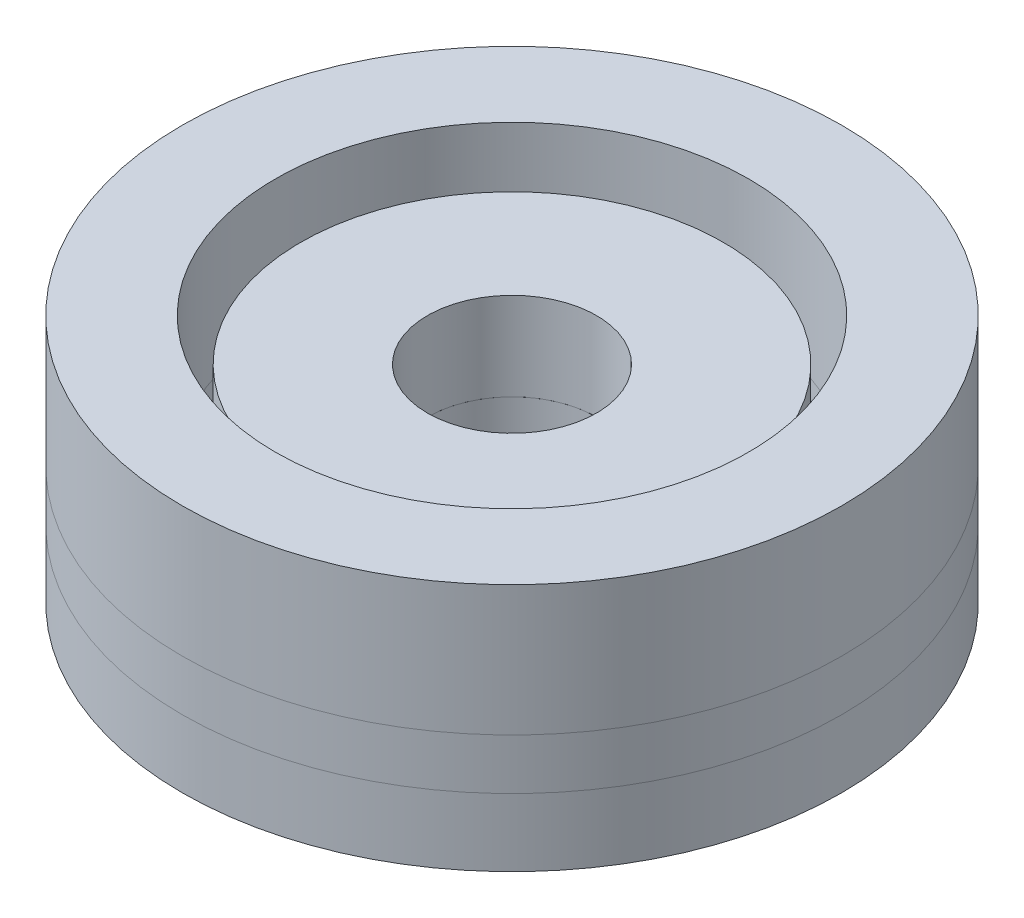
ISO-10303-21;
HEADER;
FILE_DESCRIPTION(('STEP AP214'),'2;1');
FILE_NAME('part.step','',(''),(''),'','','');
FILE_SCHEMA(('AUTOMOTIVE_DESIGN { 1 0 10303 214 1 1 1 1 }'));
ENDSEC;
DATA;
#1=APPLICATION_CONTEXT('core data for automotive mechanical design processes');
#2=APPLICATION_PROTOCOL_DEFINITION('international standard','automotive_design',2000,#1);
#3=PRODUCT_CONTEXT('',#1,'mechanical');
#4=PRODUCT('Part','Part','',(#3));
#5=PRODUCT_RELATED_PRODUCT_CATEGORY('part','',(#4));
#6=PRODUCT_DEFINITION_FORMATION('','',#4);
#7=PRODUCT_DEFINITION_CONTEXT('part definition',#1,'design');
#8=PRODUCT_DEFINITION('design','',#6,#7);
#9=PRODUCT_DEFINITION_SHAPE('','',#8);
#10=(LENGTH_UNIT() NAMED_UNIT(*) SI_UNIT(.MILLI.,.METRE.));
#11=(NAMED_UNIT(*) PLANE_ANGLE_UNIT() SI_UNIT($,.RADIAN.));
#12=(NAMED_UNIT(*) SI_UNIT($,.STERADIAN.) SOLID_ANGLE_UNIT());
#13=UNCERTAINTY_MEASURE_WITH_UNIT(LENGTH_MEASURE(1.E-05),#10,'distance_accuracy_value','');
#14=(GEOMETRIC_REPRESENTATION_CONTEXT(3) GLOBAL_UNCERTAINTY_ASSIGNED_CONTEXT((#13)) GLOBAL_UNIT_ASSIGNED_CONTEXT((#10,
#11,#12)) REPRESENTATION_CONTEXT('',''));
#15=CARTESIAN_POINT('',(0.,0.,0.));
#16=DIRECTION('',(0.,0.,1.));
#17=DIRECTION('',(1.,0.,0.));
#18=AXIS2_PLACEMENT_3D('',#15,#16,#17);
#19=CARTESIAN_POINT('',(514.982170762374,-177.,0.));
#20=DIRECTION('',(0.,-1.,0.));
#21=DIRECTION('',(0.,0.,-1.));
#22=AXIS2_PLACEMENT_3D('',#19,#20,#21);
#23=PLANE('',#22);
#24=CARTESIAN_POINT('',(514.982170762374,-177.,0.));
#25=DIRECTION('',(0.,-1.,0.));
#26=DIRECTION('',(0.,0.,-1.));
#27=AXIS2_PLACEMENT_3D('',#24,#25,#26);
#28=CIRCLE('',#27,125.);
#29=CARTESIAN_POINT('',(514.982170762374,-177.,-125.));
#30=VERTEX_POINT('',#29);
#31=EDGE_CURVE('E11',#30,#30,#28,.T.);
#32=ORIENTED_EDGE('',*,*,#31,.T.);
#33=EDGE_LOOP('',(#32));
#34=FACE_BOUND('',#33,.T.);
#35=CARTESIAN_POINT('',(514.982170762374,-177.,0.));
#36=DIRECTION('',(0.,-1.,0.));
#37=DIRECTION('',(0.,0.,-1.));
#38=AXIS2_PLACEMENT_3D('',#35,#36,#37);
#39=CIRCLE('',#38,50.0000000000001);
#40=CARTESIAN_POINT('',(514.982170762374,-177.,-50.0000000000001));
#41=VERTEX_POINT('',#40);
#42=EDGE_CURVE('E57',#41,#41,#39,.T.);
#43=ORIENTED_EDGE('',*,*,#42,.F.);
#44=EDGE_LOOP('',(#43));
#45=FACE_BOUND('',#44,.T.);
#46=ADVANCED_FACE('F46',(#34,#45),#23,.T.);
#47=CARTESIAN_POINT('',(514.982170762374,-107.,0.));
#48=DIRECTION('',(0.,-1.,0.));
#49=DIRECTION('',(0.,0.,-1.));
#50=AXIS2_PLACEMENT_3D('',#47,#48,#49);
#51=PLANE('',#50);
#52=CARTESIAN_POINT('',(514.982170762374,-107.,0.));
#53=DIRECTION('',(0.,-1.,0.));
#54=DIRECTION('',(0.,0.,-1.));
#55=AXIS2_PLACEMENT_3D('',#52,#53,#54);
#56=CIRCLE('',#55,125.);
#57=CARTESIAN_POINT('',(514.982170762374,-107.,-125.));
#58=VERTEX_POINT('',#57);
#59=EDGE_CURVE('E50',#58,#58,#56,.T.);
#60=ORIENTED_EDGE('',*,*,#59,.F.);
#61=EDGE_LOOP('',(#60));
#62=FACE_BOUND('',#61,.T.);
#63=CARTESIAN_POINT('',(514.982170762374,-107.,0.));
#64=DIRECTION('',(0.,-1.,0.));
#65=DIRECTION('',(0.,0.,-1.));
#66=AXIS2_PLACEMENT_3D('',#63,#64,#65);
#67=CIRCLE('',#66,50.0000000000001);
#68=CARTESIAN_POINT('',(514.982170762374,-107.,-50.0000000000001));
#69=VERTEX_POINT('',#68);
#70=EDGE_CURVE('E59',#69,#69,#67,.T.);
#71=ORIENTED_EDGE('',*,*,#70,.T.);
#72=EDGE_LOOP('',(#71));
#73=FACE_BOUND('',#72,.T.);
#74=ADVANCED_FACE('F69',(#62,#73),#51,.F.);
#75=CARTESIAN_POINT('',(514.982170762374,-177.,0.));
#76=DIRECTION('',(0.,1.,0.));
#77=DIRECTION('',(0.,0.,1.));
#78=AXIS2_PLACEMENT_3D('',#75,#76,#77);
#79=CYLINDRICAL_SURFACE('',#78,125.);
#80=ORIENTED_EDGE('',*,*,#31,.F.);
#81=EDGE_LOOP('',(#80));
#82=FACE_BOUND('',#81,.T.);
#83=ORIENTED_EDGE('',*,*,#59,.T.);
#84=EDGE_LOOP('',(#83));
#85=FACE_BOUND('',#84,.T.);
#86=ADVANCED_FACE('F48',(#82,#85),#79,.T.);
#87=CARTESIAN_POINT('',(514.982170762374,-177.,0.));
#88=DIRECTION('',(0.,1.,0.));
#89=DIRECTION('',(0.,0.,1.));
#90=AXIS2_PLACEMENT_3D('',#87,#88,#89);
#91=CYLINDRICAL_SURFACE('',#90,50.0000000000001);
#92=ORIENTED_EDGE('',*,*,#42,.T.);
#93=EDGE_LOOP('',(#92));
#94=FACE_BOUND('',#93,.T.);
#95=ORIENTED_EDGE('',*,*,#70,.F.);
#96=EDGE_LOOP('',(#95));
#97=FACE_BOUND('',#96,.T.);
#98=ADVANCED_FACE('F65',(#94,#97),#91,.F.);
#99=CLOSED_SHELL('',(#46,#74,#86,#98));
#100=MANIFOLD_SOLID_BREP('B2',#99);
#101=CARTESIAN_POINT('',(514.982170762374,-107.,0.));
#102=DIRECTION('',(0.,-1.,0.));
#103=DIRECTION('',(0.,0.,-1.));
#104=AXIS2_PLACEMENT_3D('',#101,#102,#103);
#105=PLANE('',#104);
#106=CARTESIAN_POINT('',(514.982170762374,-107.,0.));
#107=DIRECTION('',(0.,-1.,0.));
#108=DIRECTION('',(0.,0.,-1.));
#109=AXIS2_PLACEMENT_3D('',#106,#107,#108);
#110=CIRCLE('',#109,125.);
#111=CARTESIAN_POINT('',(514.982170762374,-107.,-125.));
#112=VERTEX_POINT('',#111);
#113=EDGE_CURVE('E45',#112,#112,#110,.T.);
#114=ORIENTED_EDGE('',*,*,#113,.T.);
#115=EDGE_LOOP('',(#114));
#116=FACE_BOUND('',#115,.T.);
#117=CARTESIAN_POINT('',(514.982170762374,-107.,0.));
#118=DIRECTION('',(0.,-1.,0.));
#119=DIRECTION('',(0.,0.,-1.));
#120=AXIS2_PLACEMENT_3D('',#117,#118,#119);
#121=CIRCLE('',#120,50.0000000000001);
#122=CARTESIAN_POINT('',(514.982170762374,-107.,-50.0000000000001));
#123=VERTEX_POINT('',#122);
#124=EDGE_CURVE('E127',#123,#123,#121,.T.);
#125=ORIENTED_EDGE('',*,*,#124,.F.);
#126=EDGE_LOOP('',(#125));
#127=FACE_BOUND('',#126,.T.);
#128=ADVANCED_FACE('F116',(#116,#127),#105,.T.);
#129=CARTESIAN_POINT('',(514.982170762374,-77.,0.));
#130=DIRECTION('',(0.,-1.,0.));
#131=DIRECTION('',(0.,0.,-1.));
#132=AXIS2_PLACEMENT_3D('',#129,#130,#131);
#133=PLANE('',#132);
#134=CARTESIAN_POINT('',(514.982170762374,-77.,0.));
#135=DIRECTION('',(0.,-1.,0.));
#136=DIRECTION('',(0.,0.,-1.));
#137=AXIS2_PLACEMENT_3D('',#134,#135,#136);
#138=CIRCLE('',#137,125.);
#139=CARTESIAN_POINT('',(514.982170762374,-77.,-125.));
#140=VERTEX_POINT('',#139);
#141=EDGE_CURVE('E120',#140,#140,#138,.T.);
#142=ORIENTED_EDGE('',*,*,#141,.F.);
#143=EDGE_LOOP('',(#142));
#144=FACE_BOUND('',#143,.T.);
#145=CARTESIAN_POINT('',(514.982170762374,-77.,0.));
#146=DIRECTION('',(0.,-1.,0.));
#147=DIRECTION('',(0.,0.,-1.));
#148=AXIS2_PLACEMENT_3D('',#145,#146,#147);
#149=CIRCLE('',#148,50.0000000000001);
#150=CARTESIAN_POINT('',(514.982170762374,-77.,-50.0000000000001));
#151=VERTEX_POINT('',#150);
#152=EDGE_CURVE('E129',#151,#151,#149,.T.);
#153=ORIENTED_EDGE('',*,*,#152,.T.);
#154=EDGE_LOOP('',(#153));
#155=FACE_BOUND('',#154,.T.);
#156=ADVANCED_FACE('F139',(#144,#155),#133,.F.);
#157=CARTESIAN_POINT('',(514.982170762374,-107.,0.));
#158=DIRECTION('',(0.,1.,0.));
#159=DIRECTION('',(0.,0.,1.));
#160=AXIS2_PLACEMENT_3D('',#157,#158,#159);
#161=CYLINDRICAL_SURFACE('',#160,125.);
#162=ORIENTED_EDGE('',*,*,#113,.F.);
#163=EDGE_LOOP('',(#162));
#164=FACE_BOUND('',#163,.T.);
#165=ORIENTED_EDGE('',*,*,#141,.T.);
#166=EDGE_LOOP('',(#165));
#167=FACE_BOUND('',#166,.T.);
#168=ADVANCED_FACE('F118',(#164,#167),#161,.T.);
#169=CARTESIAN_POINT('',(514.982170762374,-107.,0.));
#170=DIRECTION('',(0.,1.,0.));
#171=DIRECTION('',(0.,0.,1.));
#172=AXIS2_PLACEMENT_3D('',#169,#170,#171);
#173=CYLINDRICAL_SURFACE('',#172,50.0000000000001);
#174=ORIENTED_EDGE('',*,*,#124,.T.);
#175=EDGE_LOOP('',(#174));
#176=FACE_BOUND('',#175,.T.);
#177=ORIENTED_EDGE('',*,*,#152,.F.);
#178=EDGE_LOOP('',(#177));
#179=FACE_BOUND('',#178,.T.);
#180=ADVANCED_FACE('F135',(#176,#179),#173,.F.);
#181=CLOSED_SHELL('',(#128,#156,#168,#180));
#182=MANIFOLD_SOLID_BREP('B6',#181);
#183=CARTESIAN_POINT('',(514.982170762374,-77.,0.));
#184=DIRECTION('',(0.,1.,0.));
#185=DIRECTION('',(0.,0.,1.));
#186=AXIS2_PLACEMENT_3D('',#183,#184,#185);
#187=CYLINDRICAL_SURFACE('',#186,125.);
#188=CARTESIAN_POINT('',(514.982170762374,-77.,0.));
#189=DIRECTION('',(0.,1.,0.));
#190=DIRECTION('',(0.,0.,1.));
#191=AXIS2_PLACEMENT_3D('',#188,#189,#190);
#192=CIRCLE('',#191,125.);
#193=CARTESIAN_POINT('',(514.982170762374,-77.,125.));
#194=VERTEX_POINT('',#193);
#195=EDGE_CURVE('E115',#194,#194,#192,.T.);
#196=CARTESIAN_POINT('',(514.982170762374,-25.,0.));
#197=DIRECTION('',(0.,1.,0.));
#198=DIRECTION('',(0.,0.,1.));
#199=AXIS2_PLACEMENT_3D('',#196,#197,#198);
#200=CIRCLE('',#199,125.);
#201=CARTESIAN_POINT('',(514.982170762374,-25.,125.));
#202=VERTEX_POINT('',#201);
#203=EDGE_CURVE('E189',#202,#202,#200,.T.);
#204=CARTESIAN_POINT('',(514.982170762374,-77.,125.));
#205=CARTESIAN_POINT('',(514.982170762374,-76.4583333333333,125.));
#206=CARTESIAN_POINT('',(514.982170762374,-75.9166666666667,125.));
#207=CARTESIAN_POINT('',(514.982170762374,-74.8333333333333,125.));
#208=CARTESIAN_POINT('',(514.982170762374,-74.2916666666667,125.));
#209=CARTESIAN_POINT('',(514.982170762374,-73.2083333333333,125.));
#210=CARTESIAN_POINT('',(514.982170762374,-72.6666666666667,125.));
#211=CARTESIAN_POINT('',(514.982170762374,-71.5833333333333,125.));
#212=CARTESIAN_POINT('',(514.982170762374,-71.0416666666667,125.));
#213=CARTESIAN_POINT('',(514.982170762374,-69.9583333333333,125.));
#214=CARTESIAN_POINT('',(514.982170762374,-69.4166666666667,125.));
#215=CARTESIAN_POINT('',(514.982170762374,-68.3333333333333,125.));
#216=CARTESIAN_POINT('',(514.982170762374,-67.7916666666667,125.));
#217=CARTESIAN_POINT('',(514.982170762374,-66.7083333333333,125.));
#218=CARTESIAN_POINT('',(514.982170762374,-66.1666666666667,125.));
#219=CARTESIAN_POINT('',(514.982170762374,-65.0833333333333,125.));
#220=CARTESIAN_POINT('',(514.982170762374,-64.5416666666667,125.));
#221=CARTESIAN_POINT('',(514.982170762374,-63.4583333333333,125.));
#222=CARTESIAN_POINT('',(514.982170762374,-62.9166666666667,125.));
#223=CARTESIAN_POINT('',(514.982170762374,-61.8333333333333,125.));
#224=CARTESIAN_POINT('',(514.982170762374,-61.2916666666667,125.));
#225=CARTESIAN_POINT('',(514.982170762374,-60.2083333333333,125.));
#226=CARTESIAN_POINT('',(514.982170762374,-59.6666666666667,125.));
#227=CARTESIAN_POINT('',(514.982170762374,-58.5833333333333,125.));
#228=CARTESIAN_POINT('',(514.982170762374,-58.0416666666667,125.));
#229=CARTESIAN_POINT('',(514.982170762374,-56.9583333333333,125.));
#230=CARTESIAN_POINT('',(514.982170762374,-56.4166666666667,125.));
#231=CARTESIAN_POINT('',(514.982170762374,-55.3333333333333,125.));
#232=CARTESIAN_POINT('',(514.982170762374,-54.7916666666667,125.));
#233=CARTESIAN_POINT('',(514.982170762374,-53.7083333333333,125.));
#234=CARTESIAN_POINT('',(514.982170762374,-53.1666666666667,125.));
#235=CARTESIAN_POINT('',(514.982170762374,-52.0833333333333,125.));
#236=CARTESIAN_POINT('',(514.982170762374,-51.5416666666667,125.));
#237=CARTESIAN_POINT('',(514.982170762374,-50.4583333333333,125.));
#238=CARTESIAN_POINT('',(514.982170762374,-49.9166666666667,125.));
#239=CARTESIAN_POINT('',(514.982170762374,-48.8333333333333,125.));
#240=CARTESIAN_POINT('',(514.982170762374,-48.2916666666667,125.));
#241=CARTESIAN_POINT('',(514.982170762374,-47.2083333333333,125.));
#242=CARTESIAN_POINT('',(514.982170762374,-46.6666666666667,125.));
#243=CARTESIAN_POINT('',(514.982170762374,-45.5833333333333,125.));
#244=CARTESIAN_POINT('',(514.982170762374,-45.0416666666667,125.));
#245=CARTESIAN_POINT('',(514.982170762374,-43.9583333333333,125.));
#246=CARTESIAN_POINT('',(514.982170762374,-43.4166666666667,125.));
#247=CARTESIAN_POINT('',(514.982170762374,-42.3333333333333,125.));
#248=CARTESIAN_POINT('',(514.982170762374,-41.7916666666667,125.));
#249=CARTESIAN_POINT('',(514.982170762374,-40.7083333333333,125.));
#250=CARTESIAN_POINT('',(514.982170762374,-40.1666666666667,125.));
#251=CARTESIAN_POINT('',(514.982170762374,-39.0833333333333,125.));
#252=CARTESIAN_POINT('',(514.982170762374,-38.5416666666667,125.));
#253=CARTESIAN_POINT('',(514.982170762374,-37.4583333333333,125.));
#254=CARTESIAN_POINT('',(514.982170762374,-36.9166666666667,125.));
#255=CARTESIAN_POINT('',(514.982170762374,-35.8333333333333,125.));
#256=CARTESIAN_POINT('',(514.982170762374,-35.2916666666667,125.));
#257=CARTESIAN_POINT('',(514.982170762374,-34.2083333333333,125.));
#258=CARTESIAN_POINT('',(514.982170762374,-33.6666666666667,125.));
#259=CARTESIAN_POINT('',(514.982170762374,-32.5833333333333,125.));
#260=CARTESIAN_POINT('',(514.982170762374,-32.0416666666667,125.));
#261=CARTESIAN_POINT('',(514.982170762374,-30.9583333333333,125.));
#262=CARTESIAN_POINT('',(514.982170762374,-30.4166666666667,125.));
#263=CARTESIAN_POINT('',(514.982170762374,-29.3333333333333,125.));
#264=CARTESIAN_POINT('',(514.982170762374,-28.7916666666667,125.));
#265=CARTESIAN_POINT('',(514.982170762374,-27.7083333333333,125.));
#266=CARTESIAN_POINT('',(514.982170762374,-27.1666666666667,125.));
#267=CARTESIAN_POINT('',(514.982170762374,-26.0833333333333,125.));
#268=CARTESIAN_POINT('',(514.982170762374,-25.5416666666667,125.));
#269=CARTESIAN_POINT('',(514.982170762374,-25.,125.));
#270=B_SPLINE_CURVE_WITH_KNOTS('',3,(#204,#205,#206,#207,#208,#209,#210,#211,#212,#213,#214,
#215,#216,#217,#218,#219,#220,#221,#222,#223,#224,#225,#226,#227,#228,#229,#230,#231,#232,#233,
#234,#235,#236,#237,#238,#239,#240,#241,#242,#243,#244,#245,#246,#247,#248,#249,#250,#251,#252,
#253,#254,#255,#256,#257,#258,#259,#260,#261,#262,#263,#264,#265,#266,#267,#268,#269),
.UNSPECIFIED.,.F.,.F.,(4,2,2,2,2,2,2,2,2,2,2,2,2,2,2,2,2,2,2,2,2,2,2,2,2,2,2,2,2,2,2,2,4),(0.,
1.62499999999999,3.24999999999999,4.87499999999999,6.49999999999999,8.12499999999999,
9.74999999999999,11.375,13.,14.625,16.25,17.875,19.5,21.125,22.75,24.375,26.,27.625,29.25,
30.875,32.5,34.125,35.75,37.375,39.,40.625,42.25,43.875,45.5,47.125,48.75,50.375,52.),.UNSPECIFIED.);
#271=EDGE_CURVE('BSEAM186',#194,#202,#270,.T.);
#272=ORIENTED_EDGE('',*,*,#195,.T.);
#273=ORIENTED_EDGE('',*,*,#203,.F.);
#274=ORIENTED_EDGE('',*,*,#271,.T.);
#275=ORIENTED_EDGE('',*,*,#271,.F.);
#276=EDGE_LOOP('',(#272,#274,#273,#275));
#277=FACE_BOUND('',#276,.T.);
#278=ADVANCED_FACE('F186',(#277),#187,.T.);
#279=CARTESIAN_POINT('',(514.982170762374,-77.,0.));
#280=DIRECTION('',(0.,1.,0.));
#281=DIRECTION('',(0.,0.,1.));
#282=AXIS2_PLACEMENT_3D('',#279,#280,#281);
#283=PLANE('',#282);
#284=CARTESIAN_POINT('',(514.982170762374,-77.,0.));
#285=DIRECTION('',(0.,1.,0.));
#286=DIRECTION('',(0.,0.,1.));
#287=AXIS2_PLACEMENT_3D('',#284,#285,#286);
#288=CIRCLE('',#287,50.);
#289=CARTESIAN_POINT('',(514.982170762374,-77.,50.));
#290=VERTEX_POINT('',#289);
#291=EDGE_CURVE('E196',#290,#290,#288,.T.);
#292=ORIENTED_EDGE('',*,*,#291,.T.);
#293=EDGE_LOOP('',(#292));
#294=FACE_BOUND('',#293,.T.);
#295=ORIENTED_EDGE('',*,*,#195,.F.);
#296=EDGE_LOOP('',(#295));
#297=FACE_BOUND('',#296,.T.);
#298=ADVANCED_FACE('F204',(#294,#297),#283,.F.);
#299=CARTESIAN_POINT('',(514.982170762374,-25.,0.));
#300=DIRECTION('',(0.,1.,0.));
#301=DIRECTION('',(0.,0.,1.));
#302=AXIS2_PLACEMENT_3D('',#299,#300,#301);
#303=PLANE('',#302);
#304=CARTESIAN_POINT('',(514.982170762374,-25.,0.));
#305=DIRECTION('',(0.,1.,0.));
#306=DIRECTION('',(0.,0.,1.));
#307=AXIS2_PLACEMENT_3D('',#304,#305,#306);
#308=CIRCLE('',#307,50.);
#309=CARTESIAN_POINT('',(514.982170762374,-25.,50.));
#310=VERTEX_POINT('',#309);
#311=EDGE_CURVE('E198',#310,#310,#308,.T.);
#312=ORIENTED_EDGE('',*,*,#311,.F.);
#313=EDGE_LOOP('',(#312));
#314=FACE_BOUND('',#313,.T.);
#315=ORIENTED_EDGE('',*,*,#203,.T.);
#316=EDGE_LOOP('',(#315));
#317=FACE_BOUND('',#316,.T.);
#318=ADVANCED_FACE('F210',(#314,#317),#303,.T.);
#319=CARTESIAN_POINT('',(514.982170762374,-77.,0.));
#320=DIRECTION('',(0.,1.,0.));
#321=DIRECTION('',(0.,0.,1.));
#322=AXIS2_PLACEMENT_3D('',#319,#320,#321);
#323=CYLINDRICAL_SURFACE('',#322,50.);
#324=CARTESIAN_POINT('',(514.982170762374,-77.,50.));
#325=CARTESIAN_POINT('',(514.982170762374,-76.4583333333334,50.));
#326=CARTESIAN_POINT('',(514.982170762374,-75.9166666666667,50.));
#327=CARTESIAN_POINT('',(514.982170762374,-74.8333333333333,50.));
#328=CARTESIAN_POINT('',(514.982170762374,-74.2916666666667,50.));
#329=CARTESIAN_POINT('',(514.982170762374,-73.2083333333333,50.));
#330=CARTESIAN_POINT('',(514.982170762374,-72.6666666666667,50.));
#331=CARTESIAN_POINT('',(514.982170762374,-71.5833333333333,50.));
#332=CARTESIAN_POINT('',(514.982170762374,-71.0416666666667,50.));
#333=CARTESIAN_POINT('',(514.982170762374,-69.9583333333333,50.));
#334=CARTESIAN_POINT('',(514.982170762374,-69.4166666666667,50.));
#335=CARTESIAN_POINT('',(514.982170762374,-68.3333333333333,50.));
#336=CARTESIAN_POINT('',(514.982170762374,-67.7916666666667,50.));
#337=CARTESIAN_POINT('',(514.982170762374,-66.7083333333333,50.));
#338=CARTESIAN_POINT('',(514.982170762374,-66.1666666666667,50.));
#339=CARTESIAN_POINT('',(514.982170762374,-65.0833333333333,50.));
#340=CARTESIAN_POINT('',(514.982170762374,-64.5416666666667,50.));
#341=CARTESIAN_POINT('',(514.982170762374,-63.4583333333333,50.));
#342=CARTESIAN_POINT('',(514.982170762374,-62.9166666666667,50.));
#343=CARTESIAN_POINT('',(514.982170762374,-61.8333333333333,50.));
#344=CARTESIAN_POINT('',(514.982170762374,-61.2916666666667,50.));
#345=CARTESIAN_POINT('',(514.982170762374,-60.2083333333333,50.));
#346=CARTESIAN_POINT('',(514.982170762374,-59.6666666666667,50.));
#347=CARTESIAN_POINT('',(514.982170762374,-58.5833333333333,50.));
#348=CARTESIAN_POINT('',(514.982170762374,-58.0416666666667,50.));
#349=CARTESIAN_POINT('',(514.982170762374,-56.9583333333333,50.));
#350=CARTESIAN_POINT('',(514.982170762374,-56.4166666666667,50.));
#351=CARTESIAN_POINT('',(514.982170762374,-55.3333333333333,50.));
#352=CARTESIAN_POINT('',(514.982170762374,-54.7916666666667,50.));
#353=CARTESIAN_POINT('',(514.982170762374,-53.7083333333333,50.));
#354=CARTESIAN_POINT('',(514.982170762374,-53.1666666666667,50.));
#355=CARTESIAN_POINT('',(514.982170762374,-52.0833333333333,50.));
#356=CARTESIAN_POINT('',(514.982170762374,-51.5416666666667,50.));
#357=CARTESIAN_POINT('',(514.982170762374,-50.4583333333333,50.));
#358=CARTESIAN_POINT('',(514.982170762374,-49.9166666666667,50.));
#359=CARTESIAN_POINT('',(514.982170762374,-48.8333333333333,50.));
#360=CARTESIAN_POINT('',(514.982170762374,-48.2916666666667,50.));
#361=CARTESIAN_POINT('',(514.982170762374,-47.2083333333333,50.));
#362=CARTESIAN_POINT('',(514.982170762374,-46.6666666666667,50.));
#363=CARTESIAN_POINT('',(514.982170762374,-45.5833333333333,50.));
#364=CARTESIAN_POINT('',(514.982170762374,-45.0416666666667,50.));
#365=CARTESIAN_POINT('',(514.982170762374,-43.9583333333333,50.));
#366=CARTESIAN_POINT('',(514.982170762374,-43.4166666666667,50.));
#367=CARTESIAN_POINT('',(514.982170762374,-42.3333333333333,50.));
#368=CARTESIAN_POINT('',(514.982170762374,-41.7916666666667,50.));
#369=CARTESIAN_POINT('',(514.982170762374,-40.7083333333333,50.));
#370=CARTESIAN_POINT('',(514.982170762374,-40.1666666666667,50.));
#371=CARTESIAN_POINT('',(514.982170762374,-39.0833333333333,50.));
#372=CARTESIAN_POINT('',(514.982170762374,-38.5416666666667,50.));
#373=CARTESIAN_POINT('',(514.982170762374,-37.4583333333333,50.));
#374=CARTESIAN_POINT('',(514.982170762374,-36.9166666666667,50.));
#375=CARTESIAN_POINT('',(514.982170762374,-35.8333333333333,50.));
#376=CARTESIAN_POINT('',(514.982170762374,-35.2916666666667,50.));
#377=CARTESIAN_POINT('',(514.982170762374,-34.2083333333333,50.));
#378=CARTESIAN_POINT('',(514.982170762374,-33.6666666666667,50.));
#379=CARTESIAN_POINT('',(514.982170762374,-32.5833333333333,50.));
#380=CARTESIAN_POINT('',(514.982170762374,-32.0416666666667,50.));
#381=CARTESIAN_POINT('',(514.982170762374,-30.9583333333333,50.));
#382=CARTESIAN_POINT('',(514.982170762374,-30.4166666666667,50.));
#383=CARTESIAN_POINT('',(514.982170762374,-29.3333333333333,50.));
#384=CARTESIAN_POINT('',(514.982170762374,-28.7916666666667,50.));
#385=CARTESIAN_POINT('',(514.982170762374,-27.7083333333333,50.));
#386=CARTESIAN_POINT('',(514.982170762374,-27.1666666666667,50.));
#387=CARTESIAN_POINT('',(514.982170762374,-26.0833333333333,50.));
#388=CARTESIAN_POINT('',(514.982170762374,-25.5416666666667,50.));
#389=CARTESIAN_POINT('',(514.982170762374,-25.,50.));
#390=B_SPLINE_CURVE_WITH_KNOTS('',3,(#324,#325,#326,#327,#328,#329,#330,#331,#332,#333,#334,
#335,#336,#337,#338,#339,#340,#341,#342,#343,#344,#345,#346,#347,#348,#349,#350,#351,#352,#353,
#354,#355,#356,#357,#358,#359,#360,#361,#362,#363,#364,#365,#366,#367,#368,#369,#370,#371,#372,
#373,#374,#375,#376,#377,#378,#379,#380,#381,#382,#383,#384,#385,#386,#387,#388,#389),
.UNSPECIFIED.,.F.,.F.,(4,2,2,2,2,2,2,2,2,2,2,2,2,2,2,2,2,2,2,2,2,2,2,2,2,2,2,2,2,2,2,2,4),(0.,
1.625,3.25,4.875,6.50000000000001,8.12500000000001,9.75000000000001,11.375,13.,14.625,16.25,
17.875,19.5,21.125,22.75,24.375,26.,27.625,29.25,30.875,32.5,34.125,35.75,37.375,39.,40.625,
42.25,43.875,45.5,47.125,48.75,50.375,52.),.UNSPECIFIED.);
#391=EDGE_CURVE('BSEAM207',#290,#310,#390,.T.);
#392=ORIENTED_EDGE('',*,*,#291,.F.);
#393=ORIENTED_EDGE('',*,*,#311,.T.);
#394=ORIENTED_EDGE('',*,*,#391,.T.);
#395=ORIENTED_EDGE('',*,*,#391,.F.);
#396=EDGE_LOOP('',(#392,#394,#393,#395));
#397=FACE_BOUND('',#396,.T.);
#398=ADVANCED_FACE('F207',(#397),#323,.F.);
#399=CLOSED_SHELL('',(#278,#298,#318,#398));
#400=MANIFOLD_SOLID_BREP('B40',#399);
#401=CARTESIAN_POINT('',(514.982170762374,-147.,0.));
#402=DIRECTION('',(0.,-1.,0.));
#403=DIRECTION('',(0.,0.,-1.));
#404=AXIS2_PLACEMENT_3D('',#401,#402,#403);
#405=PLANE('',#404);
#406=CARTESIAN_POINT('',(514.982170762374,-147.,0.));
#407=DIRECTION('',(0.,-1.,0.));
#408=DIRECTION('',(0.,0.,-1.));
#409=AXIS2_PLACEMENT_3D('',#406,#407,#408);
#410=CIRCLE('',#409,195.);
#411=CARTESIAN_POINT('',(514.982170762374,-147.,-195.));
#412=VERTEX_POINT('',#411);
#413=EDGE_CURVE('E185',#412,#412,#410,.T.);
#414=ORIENTED_EDGE('',*,*,#413,.T.);
#415=EDGE_LOOP('',(#414));
#416=FACE_BOUND('',#415,.T.);
#417=CARTESIAN_POINT('',(514.982170762374,-147.,0.));
#418=DIRECTION('',(0.,-1.,0.));
#419=DIRECTION('',(0.,0.,-1.));
#420=AXIS2_PLACEMENT_3D('',#417,#418,#419);
#421=CIRCLE('',#420,165.);
#422=CARTESIAN_POINT('',(514.982170762374,-147.,-165.));
#423=VERTEX_POINT('',#422);
#424=EDGE_CURVE('E267',#423,#423,#421,.T.);
#425=ORIENTED_EDGE('',*,*,#424,.F.);
#426=EDGE_LOOP('',(#425));
#427=FACE_BOUND('',#426,.T.);
#428=ADVANCED_FACE('F256',(#416,#427),#405,.T.);
#429=CARTESIAN_POINT('',(514.982170762374,-107.,0.));
#430=DIRECTION('',(0.,-1.,0.));
#431=DIRECTION('',(0.,0.,-1.));
#432=AXIS2_PLACEMENT_3D('',#429,#430,#431);
#433=PLANE('',#432);
#434=CARTESIAN_POINT('',(514.982170762374,-107.,0.));
#435=DIRECTION('',(0.,-1.,0.));
#436=DIRECTION('',(0.,0.,-1.));
#437=AXIS2_PLACEMENT_3D('',#434,#435,#436);
#438=CIRCLE('',#437,195.);
#439=CARTESIAN_POINT('',(514.982170762374,-107.,-195.));
#440=VERTEX_POINT('',#439);
#441=EDGE_CURVE('E260',#440,#440,#438,.T.);
#442=ORIENTED_EDGE('',*,*,#441,.F.);
#443=EDGE_LOOP('',(#442));
#444=FACE_BOUND('',#443,.T.);
#445=CARTESIAN_POINT('',(514.982170762374,-107.,0.));
#446=DIRECTION('',(0.,-1.,0.));
#447=DIRECTION('',(0.,0.,-1.));
#448=AXIS2_PLACEMENT_3D('',#445,#446,#447);
#449=CIRCLE('',#448,165.);
#450=CARTESIAN_POINT('',(514.982170762374,-107.,-165.));
#451=VERTEX_POINT('',#450);
#452=EDGE_CURVE('E269',#451,#451,#449,.T.);
#453=ORIENTED_EDGE('',*,*,#452,.T.);
#454=EDGE_LOOP('',(#453));
#455=FACE_BOUND('',#454,.T.);
#456=ADVANCED_FACE('F279',(#444,#455),#433,.F.);
#457=CARTESIAN_POINT('',(514.982170762374,-147.,0.));
#458=DIRECTION('',(0.,1.,0.));
#459=DIRECTION('',(0.,0.,1.));
#460=AXIS2_PLACEMENT_3D('',#457,#458,#459);
#461=CYLINDRICAL_SURFACE('',#460,195.);
#462=ORIENTED_EDGE('',*,*,#413,.F.);
#463=EDGE_LOOP('',(#462));
#464=FACE_BOUND('',#463,.T.);
#465=ORIENTED_EDGE('',*,*,#441,.T.);
#466=EDGE_LOOP('',(#465));
#467=FACE_BOUND('',#466,.T.);
#468=ADVANCED_FACE('F258',(#464,#467),#461,.T.);
#469=CARTESIAN_POINT('',(514.982170762374,-147.,0.));
#470=DIRECTION('',(0.,1.,0.));
#471=DIRECTION('',(0.,0.,1.));
#472=AXIS2_PLACEMENT_3D('',#469,#470,#471);
#473=CYLINDRICAL_SURFACE('',#472,165.);
#474=ORIENTED_EDGE('',*,*,#424,.T.);
#475=EDGE_LOOP('',(#474));
#476=FACE_BOUND('',#475,.T.);
#477=ORIENTED_EDGE('',*,*,#452,.F.);
#478=EDGE_LOOP('',(#477));
#479=FACE_BOUND('',#478,.T.);
#480=ADVANCED_FACE('F275',(#476,#479),#473,.F.);
#481=CLOSED_SHELL('',(#428,#456,#468,#480));
#482=MANIFOLD_SOLID_BREP('B110',#481);
#483=CARTESIAN_POINT('',(514.982170762374,-107.,0.));
#484=DIRECTION('',(0.,-1.,0.));
#485=DIRECTION('',(0.,0.,-1.));
#486=AXIS2_PLACEMENT_3D('',#483,#484,#485);
#487=PLANE('',#486);
#488=CARTESIAN_POINT('',(514.982170762374,-107.,0.));
#489=DIRECTION('',(0.,-1.,0.));
#490=DIRECTION('',(0.,0.,-1.));
#491=AXIS2_PLACEMENT_3D('',#488,#489,#490);
#492=CIRCLE('',#491,195.);
#493=CARTESIAN_POINT('',(514.982170762374,-107.,-195.));
#494=VERTEX_POINT('',#493);
#495=EDGE_CURVE('E255',#494,#494,#492,.T.);
#496=ORIENTED_EDGE('',*,*,#495,.T.);
#497=EDGE_LOOP('',(#496));
#498=FACE_BOUND('',#497,.T.);
#499=CARTESIAN_POINT('',(514.982170762374,-107.,0.));
#500=DIRECTION('',(0.,-1.,0.));
#501=DIRECTION('',(0.,0.,-1.));
#502=AXIS2_PLACEMENT_3D('',#499,#500,#501);
#503=CIRCLE('',#502,140.);
#504=CARTESIAN_POINT('',(514.982170762374,-107.,-140.));
#505=VERTEX_POINT('',#504);
#506=EDGE_CURVE('E336',#505,#505,#503,.T.);
#507=ORIENTED_EDGE('',*,*,#506,.F.);
#508=EDGE_LOOP('',(#507));
#509=FACE_BOUND('',#508,.T.);
#510=ADVANCED_FACE('F325',(#498,#509),#487,.T.);
#511=CARTESIAN_POINT('',(514.982170762374,-77.,0.));
#512=DIRECTION('',(0.,-1.,0.));
#513=DIRECTION('',(0.,0.,-1.));
#514=AXIS2_PLACEMENT_3D('',#511,#512,#513);
#515=PLANE('',#514);
#516=CARTESIAN_POINT('',(514.982170762374,-77.,0.));
#517=DIRECTION('',(0.,-1.,0.));
#518=DIRECTION('',(0.,0.,-1.));
#519=AXIS2_PLACEMENT_3D('',#516,#517,#518);
#520=CIRCLE('',#519,195.);
#521=CARTESIAN_POINT('',(514.982170762374,-77.,-195.));
#522=VERTEX_POINT('',#521);
#523=EDGE_CURVE('E329',#522,#522,#520,.T.);
#524=ORIENTED_EDGE('',*,*,#523,.F.);
#525=EDGE_LOOP('',(#524));
#526=FACE_BOUND('',#525,.T.);
#527=CARTESIAN_POINT('',(514.982170762374,-77.,0.));
#528=DIRECTION('',(0.,-1.,0.));
#529=DIRECTION('',(0.,0.,-1.));
#530=AXIS2_PLACEMENT_3D('',#527,#528,#529);
#531=CIRCLE('',#530,140.);
#532=CARTESIAN_POINT('',(514.982170762374,-77.,-140.));
#533=VERTEX_POINT('',#532);
#534=EDGE_CURVE('E338',#533,#533,#531,.T.);
#535=ORIENTED_EDGE('',*,*,#534,.T.);
#536=EDGE_LOOP('',(#535));
#537=FACE_BOUND('',#536,.T.);
#538=ADVANCED_FACE('F348',(#526,#537),#515,.F.);
#539=CARTESIAN_POINT('',(514.982170762374,-107.,0.));
#540=DIRECTION('',(0.,1.,0.));
#541=DIRECTION('',(0.,0.,1.));
#542=AXIS2_PLACEMENT_3D('',#539,#540,#541);
#543=CYLINDRICAL_SURFACE('',#542,195.);
#544=ORIENTED_EDGE('',*,*,#495,.F.);
#545=EDGE_LOOP('',(#544));
#546=FACE_BOUND('',#545,.T.);
#547=ORIENTED_EDGE('',*,*,#523,.T.);
#548=EDGE_LOOP('',(#547));
#549=FACE_BOUND('',#548,.T.);
#550=ADVANCED_FACE('F327',(#546,#549),#543,.T.);
#551=CARTESIAN_POINT('',(514.982170762374,-107.,0.));
#552=DIRECTION('',(0.,1.,0.));
#553=DIRECTION('',(0.,0.,1.));
#554=AXIS2_PLACEMENT_3D('',#551,#552,#553);
#555=CYLINDRICAL_SURFACE('',#554,140.);
#556=ORIENTED_EDGE('',*,*,#506,.T.);
#557=EDGE_LOOP('',(#556));
#558=FACE_BOUND('',#557,.T.);
#559=ORIENTED_EDGE('',*,*,#534,.F.);
#560=EDGE_LOOP('',(#559));
#561=FACE_BOUND('',#560,.T.);
#562=ADVANCED_FACE('F344',(#558,#561),#555,.F.);
#563=CLOSED_SHELL('',(#510,#538,#550,#562));
#564=MANIFOLD_SOLID_BREP('B180',#563);
#565=CARTESIAN_POINT('',(514.982170762374,-77.,0.));
#566=DIRECTION('',(0.,1.,0.));
#567=DIRECTION('',(0.,0.,1.));
#568=AXIS2_PLACEMENT_3D('',#565,#566,#567);
#569=CYLINDRICAL_SURFACE('',#568,195.);
#570=CARTESIAN_POINT('',(514.982170762374,-77.,0.));
#571=DIRECTION('',(0.,1.,0.));
#572=DIRECTION('',(0.,0.,1.));
#573=AXIS2_PLACEMENT_3D('',#570,#571,#572);
#574=CIRCLE('',#573,195.);
#575=CARTESIAN_POINT('',(514.982170762374,-77.,195.));
#576=VERTEX_POINT('',#575);
#577=EDGE_CURVE('E324',#576,#576,#574,.T.);
#578=ORIENTED_EDGE('',*,*,#577,.T.);
#579=EDGE_LOOP('',(#578));
#580=FACE_BOUND('',#579,.T.);
#581=CARTESIAN_POINT('',(514.982170762374,0.,0.));
#582=DIRECTION('',(0.,1.,0.));
#583=DIRECTION('',(0.,0.,1.));
#584=AXIS2_PLACEMENT_3D('',#581,#582,#583);
#585=CIRCLE('',#584,195.);
#586=CARTESIAN_POINT('',(514.982170762374,0.,195.));
#587=VERTEX_POINT('',#586);
#588=EDGE_CURVE('E390',#587,#587,#585,.T.);
#589=ORIENTED_EDGE('',*,*,#588,.F.);
#590=EDGE_LOOP('',(#589));
#591=FACE_BOUND('',#590,.T.);
#592=ADVANCED_FACE('F387',(#580,#591),#569,.T.);
#593=CARTESIAN_POINT('',(514.982170762374,-77.,0.));
#594=DIRECTION('',(0.,1.,0.));
#595=DIRECTION('',(0.,0.,1.));
#596=AXIS2_PLACEMENT_3D('',#593,#594,#595);
#597=PLANE('',#596);
#598=CARTESIAN_POINT('',(514.982170762374,-77.,0.));
#599=DIRECTION('',(0.,1.,0.));
#600=DIRECTION('',(0.,0.,1.));
#601=AXIS2_PLACEMENT_3D('',#598,#599,#600);
#602=CIRCLE('',#601,140.);
#603=CARTESIAN_POINT('',(514.982170762374,-77.,140.));
#604=VERTEX_POINT('',#603);
#605=EDGE_CURVE('E397',#604,#604,#602,.T.);
#606=ORIENTED_EDGE('',*,*,#605,.T.);
#607=EDGE_LOOP('',(#606));
#608=FACE_BOUND('',#607,.T.);
#609=ORIENTED_EDGE('',*,*,#577,.F.);
#610=EDGE_LOOP('',(#609));
#611=FACE_BOUND('',#610,.T.);
#612=ADVANCED_FACE('F405',(#608,#611),#597,.F.);
#613=CARTESIAN_POINT('',(514.982170762374,0.,0.));
#614=DIRECTION('',(0.,1.,0.));
#615=DIRECTION('',(0.,0.,1.));
#616=AXIS2_PLACEMENT_3D('',#613,#614,#615);
#617=PLANE('',#616);
#618=CARTESIAN_POINT('',(514.982170762374,0.,0.));
#619=DIRECTION('',(0.,1.,0.));
#620=DIRECTION('',(0.,0.,1.));
#621=AXIS2_PLACEMENT_3D('',#618,#619,#620);
#622=CIRCLE('',#621,140.);
#623=CARTESIAN_POINT('',(514.982170762374,0.,140.));
#624=VERTEX_POINT('',#623);
#625=EDGE_CURVE('E399',#624,#624,#622,.T.);
#626=ORIENTED_EDGE('',*,*,#625,.F.);
#627=EDGE_LOOP('',(#626));
#628=FACE_BOUND('',#627,.T.);
#629=ORIENTED_EDGE('',*,*,#588,.T.);
#630=EDGE_LOOP('',(#629));
#631=FACE_BOUND('',#630,.T.);
#632=ADVANCED_FACE('F411',(#628,#631),#617,.T.);
#633=CARTESIAN_POINT('',(514.982170762374,-77.,0.));
#634=DIRECTION('',(0.,1.,0.));
#635=DIRECTION('',(0.,0.,1.));
#636=AXIS2_PLACEMENT_3D('',#633,#634,#635);
#637=CYLINDRICAL_SURFACE('',#636,140.);
#638=ORIENTED_EDGE('',*,*,#605,.F.);
#639=EDGE_LOOP('',(#638));
#640=FACE_BOUND('',#639,.T.);
#641=ORIENTED_EDGE('',*,*,#625,.T.);
#642=EDGE_LOOP('',(#641));
#643=FACE_BOUND('',#642,.T.);
#644=ADVANCED_FACE('F408',(#640,#643),#637,.F.);
#645=CLOSED_SHELL('',(#592,#612,#632,#644));
#646=MANIFOLD_SOLID_BREP('B250',#645);
#647=ADVANCED_BREP_SHAPE_REPRESENTATION('',(#18,#100,#182,#400,#482,#564,#646),#14);
#648=SHAPE_DEFINITION_REPRESENTATION(#9,#647);
ENDSEC;
END-ISO-10303-21;
